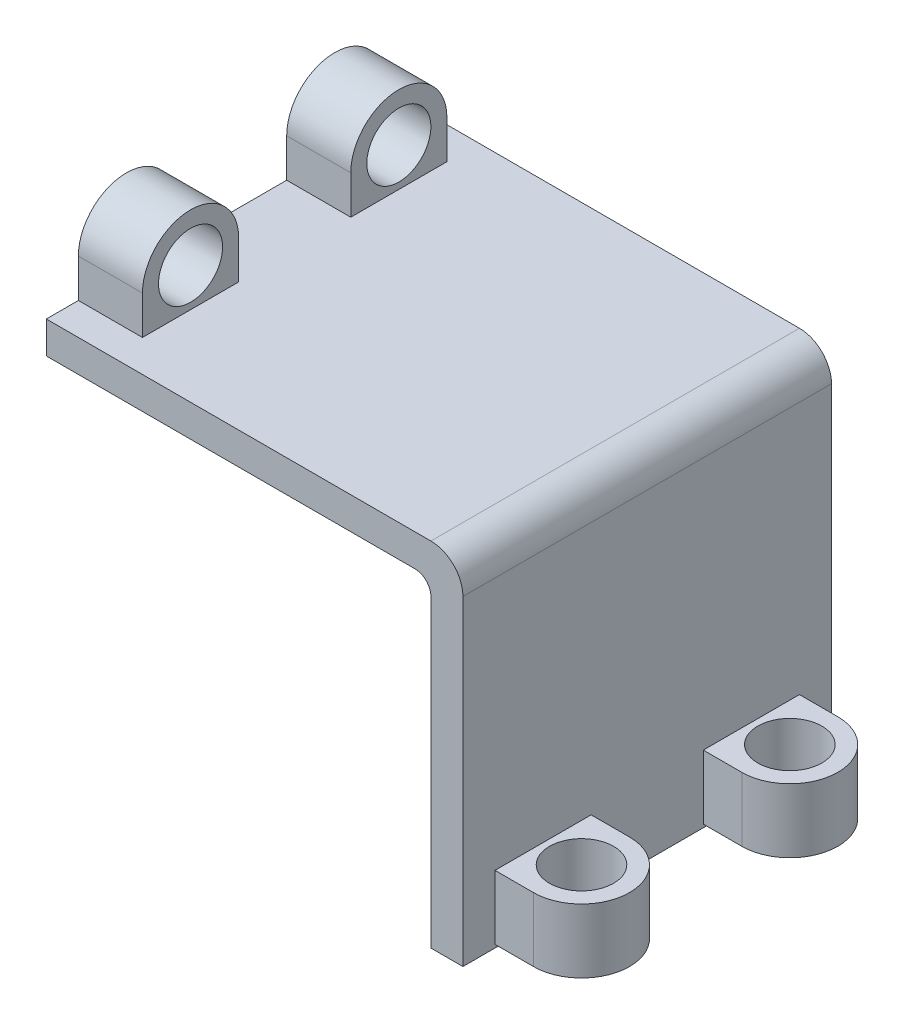
ISO-10303-21;
HEADER;
FILE_DESCRIPTION(('STEP AP214'),'2;1');
FILE_NAME('part.step','',(''),(''),'','','');
FILE_SCHEMA(('AUTOMOTIVE_DESIGN { 1 0 10303 214 1 1 1 1 }'));
ENDSEC;
DATA;
#1=APPLICATION_CONTEXT('core data for automotive mechanical design processes');
#2=APPLICATION_PROTOCOL_DEFINITION('international standard','automotive_design',2000,#1);
#3=PRODUCT_CONTEXT('',#1,'mechanical');
#4=PRODUCT('Part','Part','',(#3));
#5=PRODUCT_RELATED_PRODUCT_CATEGORY('part','',(#4));
#6=PRODUCT_DEFINITION_FORMATION('','',#4);
#7=PRODUCT_DEFINITION_CONTEXT('part definition',#1,'design');
#8=PRODUCT_DEFINITION('design','',#6,#7);
#9=PRODUCT_DEFINITION_SHAPE('','',#8);
#10=(LENGTH_UNIT() NAMED_UNIT(*) SI_UNIT(.MILLI.,.METRE.));
#11=(NAMED_UNIT(*) PLANE_ANGLE_UNIT() SI_UNIT($,.RADIAN.));
#12=(NAMED_UNIT(*) SI_UNIT($,.STERADIAN.) SOLID_ANGLE_UNIT());
#13=UNCERTAINTY_MEASURE_WITH_UNIT(LENGTH_MEASURE(1.E-05),#10,'distance_accuracy_value','');
#14=(GEOMETRIC_REPRESENTATION_CONTEXT(3) GLOBAL_UNCERTAINTY_ASSIGNED_CONTEXT((#13)) GLOBAL_UNIT_ASSIGNED_CONTEXT((#10,
#11,#12)) REPRESENTATION_CONTEXT('',''));
#15=CARTESIAN_POINT('',(0.,0.,0.));
#16=DIRECTION('',(0.,0.,1.));
#17=DIRECTION('',(1.,0.,0.));
#18=AXIS2_PLACEMENT_3D('',#15,#16,#17);
#19=CARTESIAN_POINT('',(1.,0.,11.5));
#20=DIRECTION('',(-1.,0.,0.));
#21=DIRECTION('',(0.,0.,1.));
#22=AXIS2_PLACEMENT_3D('',#19,#20,#21);
#23=PLANE('',#22);
#24=DIRECTION('',(0.,0.,1.));
#25=VECTOR('',#24,1.);
#26=CARTESIAN_POINT('',(1.,2.1,0.));
#27=LINE('',#26,#25);
#28=CARTESIAN_POINT('',(1.,2.1,7.5));
#29=VERTEX_POINT('',#28);
#30=CARTESIAN_POINT('',(1.,2.1,10.5));
#31=VERTEX_POINT('',#30);
#32=EDGE_CURVE('E297',#29,#31,#27,.T.);
#33=ORIENTED_EDGE('',*,*,#32,.F.);
#34=DIRECTION('',(0.,-1.,0.));
#35=VECTOR('',#34,1.);
#36=CARTESIAN_POINT('',(1.,2.1,7.5));
#37=LINE('',#36,#35);
#38=CARTESIAN_POINT('',(1.,0.1,7.5));
#39=VERTEX_POINT('',#38);
#40=EDGE_CURVE('E321',#29,#39,#37,.T.);
#41=ORIENTED_EDGE('',*,*,#40,.T.);
#42=DIRECTION('',(0.,0.,1.));
#43=VECTOR('',#42,1.);
#44=CARTESIAN_POINT('',(1.,0.1,0.));
#45=LINE('',#44,#43);
#46=CARTESIAN_POINT('',(1.,0.1,10.5));
#47=VERTEX_POINT('',#46);
#48=EDGE_CURVE('E314',#39,#47,#45,.T.);
#49=ORIENTED_EDGE('',*,*,#48,.T.);
#50=DIRECTION('',(0.,-1.,0.));
#51=VECTOR('',#50,1.);
#52=CARTESIAN_POINT('',(1.,2.1,10.5));
#53=LINE('',#52,#51);
#54=EDGE_CURVE('E326',#31,#47,#53,.T.);
#55=ORIENTED_EDGE('',*,*,#54,.F.);
#56=EDGE_LOOP('',(#33,#41,#49,#55));
#57=FACE_BOUND('',#56,.T.);
#58=DIRECTION('',(0.,1.,0.));
#59=VECTOR('',#58,1.);
#60=CARTESIAN_POINT('',(1.,0.,0.));
#61=LINE('',#60,#59);
#62=CARTESIAN_POINT('',(1.,0.,0.));
#63=VERTEX_POINT('',#62);
#64=CARTESIAN_POINT('',(1.,9.99999999999999,0.));
#65=VERTEX_POINT('',#64);
#66=EDGE_CURVE('E417',#63,#65,#61,.T.);
#67=ORIENTED_EDGE('',*,*,#66,.T.);
#68=DIRECTION('',(0.,0.,-1.));
#69=VECTOR('',#68,1.);
#70=CARTESIAN_POINT('',(1.,9.99999999999999,11.5));
#71=LINE('',#70,#69);
#72=CARTESIAN_POINT('',(1.,9.99999999999999,11.5));
#73=VERTEX_POINT('',#72);
#74=EDGE_CURVE('E456',#73,#65,#71,.T.);
#75=ORIENTED_EDGE('',*,*,#74,.F.);
#76=DIRECTION('',(0.,1.,0.));
#77=VECTOR('',#76,1.);
#78=CARTESIAN_POINT('',(1.,0.,11.5));
#79=LINE('',#78,#77);
#80=CARTESIAN_POINT('',(1.,0.,11.5));
#81=VERTEX_POINT('',#80);
#82=EDGE_CURVE('E392',#81,#73,#79,.T.);
#83=ORIENTED_EDGE('',*,*,#82,.F.);
#84=DIRECTION('',(0.,0.,-1.));
#85=VECTOR('',#84,1.);
#86=CARTESIAN_POINT('',(1.,0.,11.5));
#87=LINE('',#86,#85);
#88=EDGE_CURVE('E50',#81,#63,#87,.T.);
#89=ORIENTED_EDGE('',*,*,#88,.T.);
#90=EDGE_LOOP('',(#67,#75,#83,#89));
#91=FACE_BOUND('',#90,.T.);
#92=DIRECTION('',(0.,0.,-1.));
#93=VECTOR('',#92,1.);
#94=CARTESIAN_POINT('',(1.,2.1,11.5));
#95=LINE('',#94,#93);
#96=CARTESIAN_POINT('',(1.,2.1,4.));
#97=VERTEX_POINT('',#96);
#98=CARTESIAN_POINT('',(1.,2.1,1.));
#99=VERTEX_POINT('',#98);
#100=EDGE_CURVE('E207',#97,#99,#95,.T.);
#101=ORIENTED_EDGE('',*,*,#100,.T.);
#102=DIRECTION('',(0.,-1.,0.));
#103=VECTOR('',#102,1.);
#104=CARTESIAN_POINT('',(1.,2.1,1.));
#105=LINE('',#104,#103);
#106=CARTESIAN_POINT('',(1.,0.1,1.));
#107=VERTEX_POINT('',#106);
#108=EDGE_CURVE('E231',#99,#107,#105,.T.);
#109=ORIENTED_EDGE('',*,*,#108,.T.);
#110=DIRECTION('',(0.,0.,-1.));
#111=VECTOR('',#110,1.);
#112=CARTESIAN_POINT('',(1.,0.1,11.5));
#113=LINE('',#112,#111);
#114=CARTESIAN_POINT('',(1.,0.1,4.));
#115=VERTEX_POINT('',#114);
#116=EDGE_CURVE('E229',#115,#107,#113,.T.);
#117=ORIENTED_EDGE('',*,*,#116,.F.);
#118=DIRECTION('',(0.,-1.,0.));
#119=VECTOR('',#118,1.);
#120=CARTESIAN_POINT('',(1.,2.1,4.));
#121=LINE('',#120,#119);
#122=EDGE_CURVE('E223',#97,#115,#121,.T.);
#123=ORIENTED_EDGE('',*,*,#122,.F.);
#124=EDGE_LOOP('',(#101,#109,#117,#123));
#125=FACE_BOUND('',#124,.T.);
#126=ADVANCED_FACE('F41',(#57,#91,#125),#23,.F.);
#127=CARTESIAN_POINT('',(0.,11.,11.5));
#128=DIRECTION('',(0.,-1.,0.));
#129=DIRECTION('',(1.,0.,0.));
#130=AXIS2_PLACEMENT_3D('',#127,#128,#129);
#131=PLANE('',#130);
#132=DIRECTION('',(-1.,0.,0.));
#133=VECTOR('',#132,1.);
#134=CARTESIAN_POINT('',(-10.,11.,4.));
#135=LINE('',#134,#133);
#136=CARTESIAN_POINT('',(-10.,11.,4.));
#137=VERTEX_POINT('',#136);
#138=CARTESIAN_POINT('',(-12.,11.,4.));
#139=VERTEX_POINT('',#138);
#140=EDGE_CURVE('E278',#137,#139,#135,.T.);
#141=ORIENTED_EDGE('',*,*,#140,.T.);
#142=DIRECTION('',(0.,0.,-1.));
#143=VECTOR('',#142,1.);
#144=CARTESIAN_POINT('',(-12.,11.,11.5));
#145=LINE('',#144,#143);
#146=CARTESIAN_POINT('',(-12.,11.,7.5));
#147=VERTEX_POINT('',#146);
#148=EDGE_CURVE('E452',#147,#139,#145,.T.);
#149=ORIENTED_EDGE('',*,*,#148,.F.);
#150=DIRECTION('',(-1.,0.,0.));
#151=VECTOR('',#150,1.);
#152=CARTESIAN_POINT('',(-10.,11.,7.5));
#153=LINE('',#152,#151);
#154=CARTESIAN_POINT('',(-10.,11.,7.5));
#155=VERTEX_POINT('',#154);
#156=EDGE_CURVE('E378',#155,#147,#153,.T.);
#157=ORIENTED_EDGE('',*,*,#156,.F.);
#158=DIRECTION('',(0.,0.,-1.));
#159=VECTOR('',#158,1.);
#160=CARTESIAN_POINT('',(-10.,11.,0.));
#161=LINE('',#160,#159);
#162=CARTESIAN_POINT('',(-10.,11.,10.5));
#163=VERTEX_POINT('',#162);
#164=EDGE_CURVE('E345',#163,#155,#161,.T.);
#165=ORIENTED_EDGE('',*,*,#164,.F.);
#166=DIRECTION('',(-1.,0.,0.));
#167=VECTOR('',#166,1.);
#168=CARTESIAN_POINT('',(-10.,11.,10.5));
#169=LINE('',#168,#167);
#170=CARTESIAN_POINT('',(-12.,11.,10.5));
#171=VERTEX_POINT('',#170);
#172=EDGE_CURVE('E374',#163,#171,#169,.T.);
#173=ORIENTED_EDGE('',*,*,#172,.T.);
#174=CARTESIAN_POINT('',(-12.,11.,11.5));
#175=VERTEX_POINT('',#174);
#176=EDGE_CURVE('E447',#175,#171,#145,.T.);
#177=ORIENTED_EDGE('',*,*,#176,.F.);
#178=DIRECTION('',(-1.,0.,0.));
#179=VECTOR('',#178,1.);
#180=CARTESIAN_POINT('',(0.,11.,11.5));
#181=LINE('',#180,#179);
#182=CARTESIAN_POINT('',(0.,11.,11.5));
#183=VERTEX_POINT('',#182);
#184=EDGE_CURVE('E398',#183,#175,#181,.T.);
#185=ORIENTED_EDGE('',*,*,#184,.F.);
#186=DIRECTION('',(0.,0.,-1.));
#187=VECTOR('',#186,1.);
#188=CARTESIAN_POINT('',(0.,11.,11.5));
#189=LINE('',#188,#187);
#190=CARTESIAN_POINT('',(0.,11.,0.));
#191=VERTEX_POINT('',#190);
#192=EDGE_CURVE('E451',#183,#191,#189,.T.);
#193=ORIENTED_EDGE('',*,*,#192,.T.);
#194=DIRECTION('',(-1.,0.,0.));
#195=VECTOR('',#194,1.);
#196=CARTESIAN_POINT('',(0.,11.,0.));
#197=LINE('',#196,#195);
#198=CARTESIAN_POINT('',(-12.,11.,0.));
#199=VERTEX_POINT('',#198);
#200=EDGE_CURVE('E423',#191,#199,#197,.T.);
#201=ORIENTED_EDGE('',*,*,#200,.T.);
#202=CARTESIAN_POINT('',(-12.,11.,1.));
#203=VERTEX_POINT('',#202);
#204=EDGE_CURVE('E446',#203,#199,#145,.T.);
#205=ORIENTED_EDGE('',*,*,#204,.F.);
#206=DIRECTION('',(-1.,0.,0.));
#207=VECTOR('',#206,1.);
#208=CARTESIAN_POINT('',(-10.,11.,1.));
#209=LINE('',#208,#207);
#210=CARTESIAN_POINT('',(-10.,11.,1.));
#211=VERTEX_POINT('',#210);
#212=EDGE_CURVE('E282',#211,#203,#209,.T.);
#213=ORIENTED_EDGE('',*,*,#212,.F.);
#214=DIRECTION('',(0.,0.,1.));
#215=VECTOR('',#214,1.);
#216=CARTESIAN_POINT('',(-10.,11.,11.5));
#217=LINE('',#216,#215);
#218=EDGE_CURVE('E251',#211,#137,#217,.T.);
#219=ORIENTED_EDGE('',*,*,#218,.T.);
#220=EDGE_LOOP('',(#141,#149,#157,#165,#173,#177,#185,#193,#201,#205,#213,#219));
#221=FACE_BOUND('',#220,.T.);
#222=ADVANCED_FACE('F479',(#221),#131,.F.);
#223=CARTESIAN_POINT('',(0.,9.5,11.5));
#224=DIRECTION('',(1.,0.,0.));
#225=DIRECTION('',(0.,1.,0.));
#226=AXIS2_PLACEMENT_3D('',#223,#224,#225);
#227=PLANE('',#226);
#228=DIRECTION('',(0.,-1.,0.));
#229=VECTOR('',#228,1.);
#230=CARTESIAN_POINT('',(0.,9.5,0.));
#231=LINE('',#230,#229);
#232=CARTESIAN_POINT('',(0.,9.5,0.));
#233=VERTEX_POINT('',#232);
#234=CARTESIAN_POINT('',(0.,0.,0.));
#235=VERTEX_POINT('',#234);
#236=EDGE_CURVE('E373',#233,#235,#231,.T.);
#237=ORIENTED_EDGE('',*,*,#236,.T.);
#238=DIRECTION('',(0.,0.,-1.));
#239=VECTOR('',#238,1.);
#240=CARTESIAN_POINT('',(0.,0.,11.5));
#241=LINE('',#240,#239);
#242=CARTESIAN_POINT('',(0.,0.,11.5));
#243=VERTEX_POINT('',#242);
#244=EDGE_CURVE('E11',#243,#235,#241,.T.);
#245=ORIENTED_EDGE('',*,*,#244,.F.);
#246=DIRECTION('',(0.,-1.,0.));
#247=VECTOR('',#246,1.);
#248=CARTESIAN_POINT('',(0.,9.5,11.5));
#249=LINE('',#248,#247);
#250=CARTESIAN_POINT('',(0.,9.5,11.5));
#251=VERTEX_POINT('',#250);
#252=EDGE_CURVE('E384',#251,#243,#249,.T.);
#253=ORIENTED_EDGE('',*,*,#252,.F.);
#254=DIRECTION('',(0.,0.,-1.));
#255=VECTOR('',#254,1.);
#256=CARTESIAN_POINT('',(0.,9.5,11.5));
#257=LINE('',#256,#255);
#258=EDGE_CURVE('E410',#251,#233,#257,.T.);
#259=ORIENTED_EDGE('',*,*,#258,.T.);
#260=EDGE_LOOP('',(#237,#245,#253,#259));
#261=FACE_BOUND('',#260,.T.);
#262=ADVANCED_FACE('F43',(#261),#227,.F.);
#263=CARTESIAN_POINT('',(0.,0.,11.5));
#264=DIRECTION('',(0.,1.,0.));
#265=DIRECTION('',(0.,0.,1.));
#266=AXIS2_PLACEMENT_3D('',#263,#264,#265);
#267=PLANE('',#266);
#268=DIRECTION('',(1.,0.,0.));
#269=VECTOR('',#268,1.);
#270=CARTESIAN_POINT('',(0.,0.,0.));
#271=LINE('',#270,#269);
#272=EDGE_CURVE('E414',#235,#63,#271,.T.);
#273=ORIENTED_EDGE('',*,*,#272,.T.);
#274=ORIENTED_EDGE('',*,*,#88,.F.);
#275=DIRECTION('',(1.,0.,0.));
#276=VECTOR('',#275,1.);
#277=CARTESIAN_POINT('',(0.,0.,11.5));
#278=LINE('',#277,#276);
#279=EDGE_CURVE('E388',#243,#81,#278,.T.);
#280=ORIENTED_EDGE('',*,*,#279,.F.);
#281=ORIENTED_EDGE('',*,*,#244,.T.);
#282=EDGE_LOOP('',(#273,#274,#280,#281));
#283=FACE_BOUND('',#282,.T.);
#284=ADVANCED_FACE('F488',(#283),#267,.F.);
#285=CARTESIAN_POINT('',(0.,10.,11.5));
#286=DIRECTION('',(0.,0.,-1.));
#287=DIRECTION('',(-1.,0.,0.));
#288=AXIS2_PLACEMENT_3D('',#285,#286,#287);
#289=CYLINDRICAL_SURFACE('',#288,1.);
#290=CARTESIAN_POINT('',(0.,10.,0.));
#291=DIRECTION('',(0.,0.,1.));
#292=DIRECTION('',(1.,0.,0.));
#293=AXIS2_PLACEMENT_3D('',#290,#291,#292);
#294=CIRCLE('',#293,1.);
#295=EDGE_CURVE('E420',#65,#191,#294,.T.);
#296=ORIENTED_EDGE('',*,*,#295,.T.);
#297=ORIENTED_EDGE('',*,*,#192,.F.);
#298=CARTESIAN_POINT('',(0.,10.,11.5));
#299=DIRECTION('',(0.,0.,1.));
#300=DIRECTION('',(1.,0.,0.));
#301=AXIS2_PLACEMENT_3D('',#298,#299,#300);
#302=CIRCLE('',#301,1.);
#303=EDGE_CURVE('E395',#73,#183,#302,.T.);
#304=ORIENTED_EDGE('',*,*,#303,.F.);
#305=ORIENTED_EDGE('',*,*,#74,.T.);
#306=EDGE_LOOP('',(#296,#297,#304,#305));
#307=FACE_BOUND('',#306,.T.);
#308=ADVANCED_FACE('F475',(#307),#289,.T.);
#309=CARTESIAN_POINT('',(-12.,11.,11.5));
#310=DIRECTION('',(1.,0.,0.));
#311=DIRECTION('',(0.,1.,0.));
#312=AXIS2_PLACEMENT_3D('',#309,#310,#311);
#313=PLANE('',#312);
#314=DIRECTION('',(0.,-1.,0.));
#315=VECTOR('',#314,1.);
#316=CARTESIAN_POINT('',(-12.,11.,0.));
#317=LINE('',#316,#315);
#318=CARTESIAN_POINT('',(-12.,10.,0.));
#319=VERTEX_POINT('',#318);
#320=EDGE_CURVE('E427',#199,#319,#317,.T.);
#321=ORIENTED_EDGE('',*,*,#320,.T.);
#322=DIRECTION('',(0.,0.,-1.));
#323=VECTOR('',#322,1.);
#324=CARTESIAN_POINT('',(-12.,10.,11.5));
#325=LINE('',#324,#323);
#326=CARTESIAN_POINT('',(-12.,10.,11.5));
#327=VERTEX_POINT('',#326);
#328=EDGE_CURVE('E442',#327,#319,#325,.T.);
#329=ORIENTED_EDGE('',*,*,#328,.F.);
#330=DIRECTION('',(0.,-1.,0.));
#331=VECTOR('',#330,1.);
#332=CARTESIAN_POINT('',(-12.,11.,11.5));
#333=LINE('',#332,#331);
#334=EDGE_CURVE('E401',#175,#327,#333,.T.);
#335=ORIENTED_EDGE('',*,*,#334,.F.);
#336=ORIENTED_EDGE('',*,*,#176,.T.);
#337=DIRECTION('',(0.,1.,0.));
#338=VECTOR('',#337,1.);
#339=CARTESIAN_POINT('',(-12.,0.,10.5));
#340=LINE('',#339,#338);
#341=CARTESIAN_POINT('',(-12.,12.2,10.5));
#342=VERTEX_POINT('',#341);
#343=EDGE_CURVE('E363',#171,#342,#340,.T.);
#344=ORIENTED_EDGE('',*,*,#343,.T.);
#345=CARTESIAN_POINT('',(-12.,12.2,9.));
#346=DIRECTION('',(-1.,0.,0.));
#347=DIRECTION('',(0.,-1.,0.));
#348=AXIS2_PLACEMENT_3D('',#345,#346,#347);
#349=CIRCLE('',#348,1.5);
#350=CARTESIAN_POINT('',(-12.,12.2,7.5));
#351=VERTEX_POINT('',#350);
#352=EDGE_CURVE('E325',#351,#342,#349,.F.);
#353=ORIENTED_EDGE('',*,*,#352,.F.);
#354=DIRECTION('',(0.,-1.,0.));
#355=VECTOR('',#354,1.);
#356=CARTESIAN_POINT('',(-12.,0.,7.5));
#357=LINE('',#356,#355);
#358=EDGE_CURVE('E360',#351,#147,#357,.T.);
#359=ORIENTED_EDGE('',*,*,#358,.T.);
#360=ORIENTED_EDGE('',*,*,#148,.T.);
#361=DIRECTION('',(0.,-1.,0.));
#362=VECTOR('',#361,1.);
#363=CARTESIAN_POINT('',(-12.,0.,4.));
#364=LINE('',#363,#362);
#365=CARTESIAN_POINT('',(-12.,12.2,4.));
#366=VERTEX_POINT('',#365);
#367=EDGE_CURVE('E268',#366,#139,#364,.T.);
#368=ORIENTED_EDGE('',*,*,#367,.F.);
#369=CARTESIAN_POINT('',(-12.,12.2,2.5));
#370=DIRECTION('',(1.,0.,0.));
#371=DIRECTION('',(0.,-1.,0.));
#372=AXIS2_PLACEMENT_3D('',#369,#370,#371);
#373=CIRCLE('',#372,1.5);
#374=CARTESIAN_POINT('',(-12.,12.2,1.));
#375=VERTEX_POINT('',#374);
#376=EDGE_CURVE('E263',#366,#375,#373,.F.);
#377=ORIENTED_EDGE('',*,*,#376,.T.);
#378=DIRECTION('',(0.,1.,0.));
#379=VECTOR('',#378,1.);
#380=CARTESIAN_POINT('',(-12.,0.,1.));
#381=LINE('',#380,#379);
#382=EDGE_CURVE('E65',#203,#375,#381,.T.);
#383=ORIENTED_EDGE('',*,*,#382,.F.);
#384=ORIENTED_EDGE('',*,*,#204,.T.);
#385=EDGE_LOOP('',(#321,#329,#335,#336,#344,#353,#359,#360,#368,#377,#383,#384));
#386=FACE_BOUND('',#385,.T.);
#387=CARTESIAN_POINT('',(-12.,12.2,9.));
#388=DIRECTION('',(-1.,0.,0.));
#389=DIRECTION('',(0.,-1.,0.));
#390=AXIS2_PLACEMENT_3D('',#387,#388,#389);
#391=CIRCLE('',#390,0.999999999999999);
#392=CARTESIAN_POINT('',(-12.,11.2,9.));
#393=VERTEX_POINT('',#392);
#394=EDGE_CURVE('E341',#393,#393,#391,.T.);
#395=ORIENTED_EDGE('',*,*,#394,.F.);
#396=EDGE_LOOP('',(#395));
#397=FACE_BOUND('',#396,.T.);
#398=CARTESIAN_POINT('',(-12.,12.2,2.5));
#399=DIRECTION('',(1.,0.,0.));
#400=DIRECTION('',(0.,-1.,0.));
#401=AXIS2_PLACEMENT_3D('',#398,#399,#400);
#402=CIRCLE('',#401,0.999999999999999);
#403=CARTESIAN_POINT('',(-12.,11.2,2.5));
#404=VERTEX_POINT('',#403);
#405=EDGE_CURVE('E248',#404,#404,#402,.T.);
#406=ORIENTED_EDGE('',*,*,#405,.T.);
#407=EDGE_LOOP('',(#406));
#408=FACE_BOUND('',#407,.T.);
#409=ADVANCED_FACE('F500',(#386,#397,#408),#313,.F.);
#410=CARTESIAN_POINT('',(-12.,10.,11.5));
#411=DIRECTION('',(0.,1.,0.));
#412=DIRECTION('',(0.,0.,1.));
#413=AXIS2_PLACEMENT_3D('',#410,#411,#412);
#414=PLANE('',#413);
#415=DIRECTION('',(1.,0.,0.));
#416=VECTOR('',#415,1.);
#417=CARTESIAN_POINT('',(-12.,10.,0.));
#418=LINE('',#417,#416);
#419=CARTESIAN_POINT('',(-0.500000000000004,10.,0.));
#420=VERTEX_POINT('',#419);
#421=EDGE_CURVE('E430',#319,#420,#418,.T.);
#422=ORIENTED_EDGE('',*,*,#421,.T.);
#423=DIRECTION('',(0.,0.,-1.));
#424=VECTOR('',#423,1.);
#425=CARTESIAN_POINT('',(-0.500000000000004,10.,11.5));
#426=LINE('',#425,#424);
#427=CARTESIAN_POINT('',(-0.500000000000004,10.,11.5));
#428=VERTEX_POINT('',#427);
#429=EDGE_CURVE('E438',#428,#420,#426,.T.);
#430=ORIENTED_EDGE('',*,*,#429,.F.);
#431=DIRECTION('',(1.,0.,0.));
#432=VECTOR('',#431,1.);
#433=CARTESIAN_POINT('',(-12.,10.,11.5));
#434=LINE('',#433,#432);
#435=EDGE_CURVE('E404',#327,#428,#434,.T.);
#436=ORIENTED_EDGE('',*,*,#435,.F.);
#437=ORIENTED_EDGE('',*,*,#328,.T.);
#438=EDGE_LOOP('',(#422,#430,#436,#437));
#439=FACE_BOUND('',#438,.T.);
#440=ADVANCED_FACE('F499',(#439),#414,.F.);
#441=CARTESIAN_POINT('',(-0.500000000000001,9.5,11.5));
#442=DIRECTION('',(0.,0.,-1.));
#443=DIRECTION('',(-1.,0.,0.));
#444=AXIS2_PLACEMENT_3D('',#441,#442,#443);
#445=CYLINDRICAL_SURFACE('',#444,0.5);
#446=CARTESIAN_POINT('',(-0.500000000000001,9.5,0.));
#447=DIRECTION('',(0.,0.,-1.));
#448=DIRECTION('',(1.,0.,0.));
#449=AXIS2_PLACEMENT_3D('',#446,#447,#448);
#450=CIRCLE('',#449,0.5);
#451=EDGE_CURVE('E389',#420,#233,#450,.T.);
#452=ORIENTED_EDGE('',*,*,#451,.T.);
#453=ORIENTED_EDGE('',*,*,#258,.F.);
#454=CARTESIAN_POINT('',(-0.500000000000001,9.5,11.5));
#455=DIRECTION('',(0.,0.,-1.));
#456=DIRECTION('',(1.,0.,0.));
#457=AXIS2_PLACEMENT_3D('',#454,#455,#456);
#458=CIRCLE('',#457,0.5);
#459=EDGE_CURVE('E407',#428,#251,#458,.T.);
#460=ORIENTED_EDGE('',*,*,#459,.F.);
#461=ORIENTED_EDGE('',*,*,#429,.T.);
#462=EDGE_LOOP('',(#452,#453,#460,#461));
#463=FACE_BOUND('',#462,.T.);
#464=ADVANCED_FACE('F494',(#463),#445,.F.);
#465=CARTESIAN_POINT('',(0.,10.,11.5));
#466=DIRECTION('',(0.,0.,1.));
#467=DIRECTION('',(1.,0.,0.));
#468=AXIS2_PLACEMENT_3D('',#465,#466,#467);
#469=PLANE('',#468);
#470=ORIENTED_EDGE('',*,*,#252,.T.);
#471=ORIENTED_EDGE('',*,*,#279,.T.);
#472=ORIENTED_EDGE('',*,*,#82,.T.);
#473=ORIENTED_EDGE('',*,*,#303,.T.);
#474=ORIENTED_EDGE('',*,*,#184,.T.);
#475=ORIENTED_EDGE('',*,*,#334,.T.);
#476=ORIENTED_EDGE('',*,*,#435,.T.);
#477=ORIENTED_EDGE('',*,*,#459,.T.);
#478=EDGE_LOOP('',(#470,#471,#472,#473,#474,#475,#476,#477));
#479=FACE_BOUND('',#478,.T.);
#480=ADVANCED_FACE('F484',(#479),#469,.T.);
#481=CARTESIAN_POINT('',(0.,10.,0.));
#482=DIRECTION('',(0.,0.,1.));
#483=DIRECTION('',(1.,0.,0.));
#484=AXIS2_PLACEMENT_3D('',#481,#482,#483);
#485=PLANE('',#484);
#486=ORIENTED_EDGE('',*,*,#236,.F.);
#487=ORIENTED_EDGE('',*,*,#451,.F.);
#488=ORIENTED_EDGE('',*,*,#421,.F.);
#489=ORIENTED_EDGE('',*,*,#320,.F.);
#490=ORIENTED_EDGE('',*,*,#200,.F.);
#491=ORIENTED_EDGE('',*,*,#295,.F.);
#492=ORIENTED_EDGE('',*,*,#66,.F.);
#493=ORIENTED_EDGE('',*,*,#272,.F.);
#494=EDGE_LOOP('',(#486,#487,#488,#489,#490,#491,#492,#493));
#495=FACE_BOUND('',#494,.T.);
#496=ADVANCED_FACE('F470',(#495),#485,.F.);
#497=CARTESIAN_POINT('',(-10.,12.2,9.));
#498=DIRECTION('',(-1.,0.,0.));
#499=DIRECTION('',(0.,-1.,0.));
#500=AXIS2_PLACEMENT_3D('',#497,#498,#499);
#501=CYLINDRICAL_SURFACE('',#500,1.5);
#502=ORIENTED_EDGE('',*,*,#352,.T.);
#503=DIRECTION('',(-1.,0.,0.));
#504=VECTOR('',#503,1.);
#505=CARTESIAN_POINT('',(-10.,12.2,10.5));
#506=LINE('',#505,#504);
#507=CARTESIAN_POINT('',(-10.,12.2,10.5));
#508=VERTEX_POINT('',#507);
#509=EDGE_CURVE('E370',#508,#342,#506,.T.);
#510=ORIENTED_EDGE('',*,*,#509,.F.);
#511=CARTESIAN_POINT('',(-10.,12.2,9.));
#512=DIRECTION('',(-1.,0.,0.));
#513=DIRECTION('',(0.,-1.,0.));
#514=AXIS2_PLACEMENT_3D('',#511,#512,#513);
#515=CIRCLE('',#514,1.5);
#516=CARTESIAN_POINT('',(-10.,12.2,7.5));
#517=VERTEX_POINT('',#516);
#518=EDGE_CURVE('E337',#517,#508,#515,.F.);
#519=ORIENTED_EDGE('',*,*,#518,.F.);
#520=DIRECTION('',(-1.,0.,0.));
#521=VECTOR('',#520,1.);
#522=CARTESIAN_POINT('',(-10.,12.2,7.5));
#523=LINE('',#522,#521);
#524=EDGE_CURVE('E356',#517,#351,#523,.T.);
#525=ORIENTED_EDGE('',*,*,#524,.T.);
#526=EDGE_LOOP('',(#502,#510,#519,#525));
#527=FACE_BOUND('',#526,.T.);
#528=ADVANCED_FACE('F710',(#527),#501,.T.);
#529=CARTESIAN_POINT('',(-9.99999999999997,0.,10.5));
#530=DIRECTION('',(0.,0.,1.));
#531=DIRECTION('',(1.,0.,0.));
#532=AXIS2_PLACEMENT_3D('',#529,#530,#531);
#533=PLANE('',#532);
#534=ORIENTED_EDGE('',*,*,#343,.F.);
#535=ORIENTED_EDGE('',*,*,#172,.F.);
#536=DIRECTION('',(0.,1.,0.));
#537=VECTOR('',#536,1.);
#538=CARTESIAN_POINT('',(-9.99999999999997,0.,10.5));
#539=LINE('',#538,#537);
#540=EDGE_CURVE('E348',#163,#508,#539,.T.);
#541=ORIENTED_EDGE('',*,*,#540,.T.);
#542=ORIENTED_EDGE('',*,*,#509,.T.);
#543=EDGE_LOOP('',(#534,#535,#541,#542));
#544=FACE_BOUND('',#543,.T.);
#545=ADVANCED_FACE('F707',(#544),#533,.T.);
#546=CARTESIAN_POINT('',(-9.99999999999997,0.,7.5));
#547=DIRECTION('',(0.,0.,-1.));
#548=DIRECTION('',(-1.,0.,0.));
#549=AXIS2_PLACEMENT_3D('',#546,#547,#548);
#550=PLANE('',#549);
#551=ORIENTED_EDGE('',*,*,#358,.F.);
#552=ORIENTED_EDGE('',*,*,#524,.F.);
#553=DIRECTION('',(0.,-1.,0.));
#554=VECTOR('',#553,1.);
#555=CARTESIAN_POINT('',(-9.99999999999997,0.,7.5));
#556=LINE('',#555,#554);
#557=EDGE_CURVE('E340',#517,#155,#556,.T.);
#558=ORIENTED_EDGE('',*,*,#557,.T.);
#559=ORIENTED_EDGE('',*,*,#156,.T.);
#560=EDGE_LOOP('',(#551,#552,#558,#559));
#561=FACE_BOUND('',#560,.T.);
#562=ADVANCED_FACE('F705',(#561),#550,.T.);
#563=CARTESIAN_POINT('',(-10.,12.2,9.));
#564=DIRECTION('',(-1.,0.,0.));
#565=DIRECTION('',(0.,-1.,0.));
#566=AXIS2_PLACEMENT_3D('',#563,#564,#565);
#567=CYLINDRICAL_SURFACE('',#566,0.999999999999999);
#568=CARTESIAN_POINT('',(-10.,12.2,9.));
#569=DIRECTION('',(-1.,0.,0.));
#570=DIRECTION('',(0.,-1.,0.));
#571=AXIS2_PLACEMENT_3D('',#568,#569,#570);
#572=CIRCLE('',#571,0.999999999999999);
#573=CARTESIAN_POINT('',(-10.,11.2,9.));
#574=VERTEX_POINT('',#573);
#575=EDGE_CURVE('E352',#574,#574,#572,.T.);
#576=ORIENTED_EDGE('',*,*,#575,.F.);
#577=EDGE_LOOP('',(#576));
#578=FACE_BOUND('',#577,.T.);
#579=ORIENTED_EDGE('',*,*,#394,.T.);
#580=EDGE_LOOP('',(#579));
#581=FACE_BOUND('',#580,.T.);
#582=ADVANCED_FACE('F701',(#578,#581),#567,.F.);
#583=CARTESIAN_POINT('',(-9.99999999999997,0.,0.));
#584=DIRECTION('',(-1.,0.,0.));
#585=DIRECTION('',(0.,-1.,0.));
#586=AXIS2_PLACEMENT_3D('',#583,#584,#585);
#587=PLANE('',#586);
#588=ORIENTED_EDGE('',*,*,#518,.T.);
#589=ORIENTED_EDGE('',*,*,#540,.F.);
#590=ORIENTED_EDGE('',*,*,#164,.T.);
#591=ORIENTED_EDGE('',*,*,#557,.F.);
#592=EDGE_LOOP('',(#588,#589,#590,#591));
#593=FACE_BOUND('',#592,.T.);
#594=ORIENTED_EDGE('',*,*,#575,.T.);
#595=EDGE_LOOP('',(#594));
#596=FACE_BOUND('',#595,.T.);
#597=ADVANCED_FACE('F697',(#593,#596),#587,.F.);
#598=CARTESIAN_POINT('',(0.,2.1,7.5));
#599=DIRECTION('',(0.,0.,1.));
#600=DIRECTION('',(1.,0.,0.));
#601=AXIS2_PLACEMENT_3D('',#598,#599,#600);
#602=PLANE('',#601);
#603=DIRECTION('',(-1.,0.,0.));
#604=VECTOR('',#603,1.);
#605=CARTESIAN_POINT('',(0.,0.1,7.5));
#606=LINE('',#605,#604);
#607=CARTESIAN_POINT('',(2.2,0.1,7.5));
#608=VERTEX_POINT('',#607);
#609=EDGE_CURVE('E277',#608,#39,#606,.T.);
#610=ORIENTED_EDGE('',*,*,#609,.T.);
#611=ORIENTED_EDGE('',*,*,#40,.F.);
#612=DIRECTION('',(-1.,0.,0.));
#613=VECTOR('',#612,1.);
#614=CARTESIAN_POINT('',(0.,2.1,7.5));
#615=LINE('',#614,#613);
#616=CARTESIAN_POINT('',(2.2,2.1,7.5));
#617=VERTEX_POINT('',#616);
#618=EDGE_CURVE('E287',#617,#29,#615,.T.);
#619=ORIENTED_EDGE('',*,*,#618,.F.);
#620=DIRECTION('',(0.,-1.,0.));
#621=VECTOR('',#620,1.);
#622=CARTESIAN_POINT('',(2.2,2.1,7.5));
#623=LINE('',#622,#621);
#624=EDGE_CURVE('E304',#617,#608,#623,.T.);
#625=ORIENTED_EDGE('',*,*,#624,.T.);
#626=EDGE_LOOP('',(#610,#611,#619,#625));
#627=FACE_BOUND('',#626,.T.);
#628=ADVANCED_FACE('F690',(#627),#602,.F.);
#629=CARTESIAN_POINT('',(0.,2.1,10.5));
#630=DIRECTION('',(0.,0.,-1.));
#631=DIRECTION('',(-1.,0.,0.));
#632=AXIS2_PLACEMENT_3D('',#629,#630,#631);
#633=PLANE('',#632);
#634=DIRECTION('',(1.,0.,0.));
#635=VECTOR('',#634,1.);
#636=CARTESIAN_POINT('',(0.,0.1,10.5));
#637=LINE('',#636,#635);
#638=CARTESIAN_POINT('',(2.2,0.1,10.5));
#639=VERTEX_POINT('',#638);
#640=EDGE_CURVE('E311',#47,#639,#637,.T.);
#641=ORIENTED_EDGE('',*,*,#640,.T.);
#642=DIRECTION('',(0.,-1.,0.));
#643=VECTOR('',#642,1.);
#644=CARTESIAN_POINT('',(2.2,2.1,10.5));
#645=LINE('',#644,#643);
#646=CARTESIAN_POINT('',(2.2,2.1,10.5));
#647=VERTEX_POINT('',#646);
#648=EDGE_CURVE('E330',#647,#639,#645,.T.);
#649=ORIENTED_EDGE('',*,*,#648,.F.);
#650=DIRECTION('',(1.,0.,0.));
#651=VECTOR('',#650,1.);
#652=CARTESIAN_POINT('',(0.,2.1,10.5));
#653=LINE('',#652,#651);
#654=EDGE_CURVE('E294',#31,#647,#653,.T.);
#655=ORIENTED_EDGE('',*,*,#654,.F.);
#656=ORIENTED_EDGE('',*,*,#54,.T.);
#657=EDGE_LOOP('',(#641,#649,#655,#656));
#658=FACE_BOUND('',#657,.T.);
#659=ADVANCED_FACE('F687',(#658),#633,.F.);
#660=CARTESIAN_POINT('',(2.2,2.1,9.));
#661=DIRECTION('',(0.,-1.,0.));
#662=DIRECTION('',(0.,0.,-1.));
#663=AXIS2_PLACEMENT_3D('',#660,#661,#662);
#664=CYLINDRICAL_SURFACE('',#663,1.5);
#665=CARTESIAN_POINT('',(2.2,0.1,9.));
#666=DIRECTION('',(0.,-1.,0.));
#667=DIRECTION('',(0.,0.,-1.));
#668=AXIS2_PLACEMENT_3D('',#665,#666,#667);
#669=CIRCLE('',#668,1.5);
#670=EDGE_CURVE('E308',#639,#608,#669,.F.);
#671=ORIENTED_EDGE('',*,*,#670,.T.);
#672=ORIENTED_EDGE('',*,*,#624,.F.);
#673=CARTESIAN_POINT('',(2.2,2.1,9.));
#674=DIRECTION('',(0.,-1.,0.));
#675=DIRECTION('',(0.,0.,-1.));
#676=AXIS2_PLACEMENT_3D('',#673,#674,#675);
#677=CIRCLE('',#676,1.5);
#678=EDGE_CURVE('E290',#647,#617,#677,.F.);
#679=ORIENTED_EDGE('',*,*,#678,.F.);
#680=ORIENTED_EDGE('',*,*,#648,.T.);
#681=EDGE_LOOP('',(#671,#672,#679,#680));
#682=FACE_BOUND('',#681,.T.);
#683=ADVANCED_FACE('F685',(#682),#664,.T.);
#684=CARTESIAN_POINT('',(2.2,2.1,9.));
#685=DIRECTION('',(0.,-1.,0.));
#686=DIRECTION('',(0.,0.,-1.));
#687=AXIS2_PLACEMENT_3D('',#684,#685,#686);
#688=CYLINDRICAL_SURFACE('',#687,1.);
#689=CARTESIAN_POINT('',(2.2,2.1,9.));
#690=DIRECTION('',(0.,-1.,0.));
#691=DIRECTION('',(0.,0.,-1.));
#692=AXIS2_PLACEMENT_3D('',#689,#690,#691);
#693=CIRCLE('',#692,1.);
#694=CARTESIAN_POINT('',(2.2,2.1,8.));
#695=VERTEX_POINT('',#694);
#696=EDGE_CURVE('E300',#695,#695,#693,.T.);
#697=ORIENTED_EDGE('',*,*,#696,.F.);
#698=EDGE_LOOP('',(#697));
#699=FACE_BOUND('',#698,.T.);
#700=CARTESIAN_POINT('',(2.2,0.1,9.));
#701=DIRECTION('',(0.,-1.,0.));
#702=DIRECTION('',(0.,0.,-1.));
#703=AXIS2_PLACEMENT_3D('',#700,#701,#702);
#704=CIRCLE('',#703,1.);
#705=CARTESIAN_POINT('',(2.2,0.1,8.));
#706=VERTEX_POINT('',#705);
#707=EDGE_CURVE('E291',#706,#706,#704,.T.);
#708=ORIENTED_EDGE('',*,*,#707,.T.);
#709=EDGE_LOOP('',(#708));
#710=FACE_BOUND('',#709,.T.);
#711=ADVANCED_FACE('F679',(#699,#710),#688,.F.);
#712=CARTESIAN_POINT('',(0.,2.1,0.));
#713=DIRECTION('',(0.,-1.,0.));
#714=DIRECTION('',(0.,0.,-1.));
#715=AXIS2_PLACEMENT_3D('',#712,#713,#714);
#716=PLANE('',#715);
#717=ORIENTED_EDGE('',*,*,#618,.T.);
#718=ORIENTED_EDGE('',*,*,#32,.T.);
#719=ORIENTED_EDGE('',*,*,#654,.T.);
#720=ORIENTED_EDGE('',*,*,#678,.T.);
#721=EDGE_LOOP('',(#717,#718,#719,#720));
#722=FACE_BOUND('',#721,.T.);
#723=ORIENTED_EDGE('',*,*,#696,.T.);
#724=EDGE_LOOP('',(#723));
#725=FACE_BOUND('',#724,.T.);
#726=ADVANCED_FACE('F676',(#722,#725),#716,.F.);
#727=CARTESIAN_POINT('',(0.,0.1,0.));
#728=DIRECTION('',(0.,-1.,0.));
#729=DIRECTION('',(0.,0.,-1.));
#730=AXIS2_PLACEMENT_3D('',#727,#728,#729);
#731=PLANE('',#730);
#732=ORIENTED_EDGE('',*,*,#609,.F.);
#733=ORIENTED_EDGE('',*,*,#670,.F.);
#734=ORIENTED_EDGE('',*,*,#640,.F.);
#735=ORIENTED_EDGE('',*,*,#48,.F.);
#736=EDGE_LOOP('',(#732,#733,#734,#735));
#737=FACE_BOUND('',#736,.T.);
#738=ORIENTED_EDGE('',*,*,#707,.F.);
#739=EDGE_LOOP('',(#738));
#740=FACE_BOUND('',#739,.T.);
#741=ADVANCED_FACE('F581',(#737,#740),#731,.T.);
#742=CARTESIAN_POINT('',(-10.,12.2,2.5));
#743=DIRECTION('',(-1.,0.,0.));
#744=DIRECTION('',(0.,-1.,0.));
#745=AXIS2_PLACEMENT_3D('',#742,#743,#744);
#746=CYLINDRICAL_SURFACE('',#745,1.5);
#747=ORIENTED_EDGE('',*,*,#376,.F.);
#748=DIRECTION('',(-1.,0.,0.));
#749=VECTOR('',#748,1.);
#750=CARTESIAN_POINT('',(-10.,12.2,4.));
#751=LINE('',#750,#749);
#752=CARTESIAN_POINT('',(-10.,12.2,4.));
#753=VERTEX_POINT('',#752);
#754=EDGE_CURVE('E274',#753,#366,#751,.T.);
#755=ORIENTED_EDGE('',*,*,#754,.F.);
#756=CARTESIAN_POINT('',(-10.,12.2,2.5));
#757=DIRECTION('',(1.,0.,0.));
#758=DIRECTION('',(0.,-1.,0.));
#759=AXIS2_PLACEMENT_3D('',#756,#757,#758);
#760=CIRCLE('',#759,1.5);
#761=CARTESIAN_POINT('',(-10.,12.2,1.));
#762=VERTEX_POINT('',#761);
#763=EDGE_CURVE('E243',#753,#762,#760,.F.);
#764=ORIENTED_EDGE('',*,*,#763,.T.);
#765=DIRECTION('',(-1.,0.,0.));
#766=VECTOR('',#765,1.);
#767=CARTESIAN_POINT('',(-10.,12.2,1.));
#768=LINE('',#767,#766);
#769=EDGE_CURVE('E262',#762,#375,#768,.T.);
#770=ORIENTED_EDGE('',*,*,#769,.T.);
#771=EDGE_LOOP('',(#747,#755,#764,#770));
#772=FACE_BOUND('',#771,.T.);
#773=ADVANCED_FACE('F520',(#772),#746,.T.);
#774=CARTESIAN_POINT('',(-9.99999999999997,0.,4.));
#775=DIRECTION('',(0.,0.,-1.));
#776=DIRECTION('',(-1.,0.,0.));
#777=AXIS2_PLACEMENT_3D('',#774,#775,#776);
#778=PLANE('',#777);
#779=ORIENTED_EDGE('',*,*,#367,.T.);
#780=ORIENTED_EDGE('',*,*,#140,.F.);
#781=DIRECTION('',(0.,-1.,0.));
#782=VECTOR('',#781,1.);
#783=CARTESIAN_POINT('',(-9.99999999999997,0.,4.));
#784=LINE('',#783,#782);
#785=EDGE_CURVE('E255',#753,#137,#784,.T.);
#786=ORIENTED_EDGE('',*,*,#785,.F.);
#787=ORIENTED_EDGE('',*,*,#754,.T.);
#788=EDGE_LOOP('',(#779,#780,#786,#787));
#789=FACE_BOUND('',#788,.T.);
#790=ADVANCED_FACE('F517',(#789),#778,.F.);
#791=CARTESIAN_POINT('',(-9.99999999999997,0.,1.));
#792=DIRECTION('',(0.,0.,1.));
#793=DIRECTION('',(1.,0.,0.));
#794=AXIS2_PLACEMENT_3D('',#791,#792,#793);
#795=PLANE('',#794);
#796=ORIENTED_EDGE('',*,*,#382,.T.);
#797=ORIENTED_EDGE('',*,*,#769,.F.);
#798=DIRECTION('',(0.,1.,0.));
#799=VECTOR('',#798,1.);
#800=CARTESIAN_POINT('',(-9.99999999999997,0.,1.));
#801=LINE('',#800,#799);
#802=EDGE_CURVE('E247',#211,#762,#801,.T.);
#803=ORIENTED_EDGE('',*,*,#802,.F.);
#804=ORIENTED_EDGE('',*,*,#212,.T.);
#805=EDGE_LOOP('',(#796,#797,#803,#804));
#806=FACE_BOUND('',#805,.T.);
#807=ADVANCED_FACE('F523',(#806),#795,.F.);
#808=CARTESIAN_POINT('',(-10.,12.2,2.5));
#809=DIRECTION('',(-1.,0.,0.));
#810=DIRECTION('',(0.,-1.,0.));
#811=AXIS2_PLACEMENT_3D('',#808,#809,#810);
#812=CYLINDRICAL_SURFACE('',#811,0.999999999999999);
#813=CARTESIAN_POINT('',(-10.,12.2,2.5));
#814=DIRECTION('',(1.,0.,0.));
#815=DIRECTION('',(0.,-1.,0.));
#816=AXIS2_PLACEMENT_3D('',#813,#814,#815);
#817=CIRCLE('',#816,0.999999999999999);
#818=CARTESIAN_POINT('',(-10.,11.2,2.5));
#819=VERTEX_POINT('',#818);
#820=EDGE_CURVE('E258',#819,#819,#817,.T.);
#821=ORIENTED_EDGE('',*,*,#820,.T.);
#822=EDGE_LOOP('',(#821));
#823=FACE_BOUND('',#822,.T.);
#824=ORIENTED_EDGE('',*,*,#405,.F.);
#825=EDGE_LOOP('',(#824));
#826=FACE_BOUND('',#825,.T.);
#827=ADVANCED_FACE('F528',(#823,#826),#812,.F.);
#828=CARTESIAN_POINT('',(-9.99999999999997,0.,11.5));
#829=DIRECTION('',(-1.,0.,0.));
#830=DIRECTION('',(0.,-1.,0.));
#831=AXIS2_PLACEMENT_3D('',#828,#829,#830);
#832=PLANE('',#831);
#833=ORIENTED_EDGE('',*,*,#763,.F.);
#834=ORIENTED_EDGE('',*,*,#785,.T.);
#835=ORIENTED_EDGE('',*,*,#218,.F.);
#836=ORIENTED_EDGE('',*,*,#802,.T.);
#837=EDGE_LOOP('',(#833,#834,#835,#836));
#838=FACE_BOUND('',#837,.T.);
#839=ORIENTED_EDGE('',*,*,#820,.F.);
#840=EDGE_LOOP('',(#839));
#841=FACE_BOUND('',#840,.T.);
#842=ADVANCED_FACE('F525',(#838,#841),#832,.F.);
#843=CARTESIAN_POINT('',(0.,2.1,4.));
#844=DIRECTION('',(0.,0.,1.));
#845=DIRECTION('',(1.,0.,0.));
#846=AXIS2_PLACEMENT_3D('',#843,#844,#845);
#847=PLANE('',#846);
#848=DIRECTION('',(-1.,0.,0.));
#849=VECTOR('',#848,1.);
#850=CARTESIAN_POINT('',(0.,0.1,4.));
#851=LINE('',#850,#849);
#852=CARTESIAN_POINT('',(2.2,0.1,4.));
#853=VERTEX_POINT('',#852);
#854=EDGE_CURVE('E57',#853,#115,#851,.T.);
#855=ORIENTED_EDGE('',*,*,#854,.F.);
#856=DIRECTION('',(0.,-1.,0.));
#857=VECTOR('',#856,1.);
#858=CARTESIAN_POINT('',(2.2,2.1,4.));
#859=LINE('',#858,#857);
#860=CARTESIAN_POINT('',(2.2,2.1,4.));
#861=VERTEX_POINT('',#860);
#862=EDGE_CURVE('E225',#861,#853,#859,.T.);
#863=ORIENTED_EDGE('',*,*,#862,.F.);
#864=DIRECTION('',(-1.,0.,0.));
#865=VECTOR('',#864,1.);
#866=CARTESIAN_POINT('',(0.,2.1,4.));
#867=LINE('',#866,#865);
#868=EDGE_CURVE('E212',#861,#97,#867,.T.);
#869=ORIENTED_EDGE('',*,*,#868,.T.);
#870=ORIENTED_EDGE('',*,*,#122,.T.);
#871=EDGE_LOOP('',(#855,#863,#869,#870));
#872=FACE_BOUND('',#871,.T.);
#873=ADVANCED_FACE('F222',(#872),#847,.T.);
#874=CARTESIAN_POINT('',(2.2,2.1,2.5));
#875=DIRECTION('',(0.,-1.,0.));
#876=DIRECTION('',(0.,0.,-1.));
#877=AXIS2_PLACEMENT_3D('',#874,#875,#876);
#878=CYLINDRICAL_SURFACE('',#877,1.5);
#879=CARTESIAN_POINT('',(2.2,0.1,2.5));
#880=DIRECTION('',(0.,1.,0.));
#881=DIRECTION('',(0.,0.,1.));
#882=AXIS2_PLACEMENT_3D('',#879,#880,#881);
#883=CIRCLE('',#882,1.5);
#884=CARTESIAN_POINT('',(2.2,0.1,1.));
#885=VERTEX_POINT('',#884);
#886=EDGE_CURVE('E869',#885,#853,#883,.F.);
#887=ORIENTED_EDGE('',*,*,#886,.F.);
#888=DIRECTION('',(0.,-1.,0.));
#889=VECTOR('',#888,1.);
#890=CARTESIAN_POINT('',(2.2,2.1,1.));
#891=LINE('',#890,#889);
#892=CARTESIAN_POINT('',(2.2,2.1,1.));
#893=VERTEX_POINT('',#892);
#894=EDGE_CURVE('E236',#893,#885,#891,.T.);
#895=ORIENTED_EDGE('',*,*,#894,.F.);
#896=CARTESIAN_POINT('',(2.2,2.1,2.5));
#897=DIRECTION('',(0.,1.,0.));
#898=DIRECTION('',(0.,0.,1.));
#899=AXIS2_PLACEMENT_3D('',#896,#897,#898);
#900=CIRCLE('',#899,1.5);
#901=EDGE_CURVE('E239',#893,#861,#900,.F.);
#902=ORIENTED_EDGE('',*,*,#901,.T.);
#903=ORIENTED_EDGE('',*,*,#862,.T.);
#904=EDGE_LOOP('',(#887,#895,#902,#903));
#905=FACE_BOUND('',#904,.T.);
#906=ADVANCED_FACE('F620',(#905),#878,.T.);
#907=CARTESIAN_POINT('',(0.,2.1,1.));
#908=DIRECTION('',(0.,0.,-1.));
#909=DIRECTION('',(-1.,0.,0.));
#910=AXIS2_PLACEMENT_3D('',#907,#908,#909);
#911=PLANE('',#910);
#912=DIRECTION('',(1.,0.,0.));
#913=VECTOR('',#912,1.);
#914=CARTESIAN_POINT('',(0.,0.1,1.));
#915=LINE('',#914,#913);
#916=EDGE_CURVE('E872',#107,#885,#915,.T.);
#917=ORIENTED_EDGE('',*,*,#916,.F.);
#918=ORIENTED_EDGE('',*,*,#108,.F.);
#919=DIRECTION('',(1.,0.,0.));
#920=VECTOR('',#919,1.);
#921=CARTESIAN_POINT('',(0.,2.1,1.));
#922=LINE('',#921,#920);
#923=EDGE_CURVE('E215',#99,#893,#922,.T.);
#924=ORIENTED_EDGE('',*,*,#923,.T.);
#925=ORIENTED_EDGE('',*,*,#894,.T.);
#926=EDGE_LOOP('',(#917,#918,#924,#925));
#927=FACE_BOUND('',#926,.T.);
#928=ADVANCED_FACE('F629',(#927),#911,.T.);
#929=CARTESIAN_POINT('',(2.2,2.1,2.5));
#930=DIRECTION('',(0.,-1.,0.));
#931=DIRECTION('',(0.,0.,-1.));
#932=AXIS2_PLACEMENT_3D('',#929,#930,#931);
#933=CYLINDRICAL_SURFACE('',#932,1.);
#934=CARTESIAN_POINT('',(2.2,2.1,2.5));
#935=DIRECTION('',(0.,1.,0.));
#936=DIRECTION('',(0.,0.,1.));
#937=AXIS2_PLACEMENT_3D('',#934,#935,#936);
#938=CIRCLE('',#937,1.);
#939=CARTESIAN_POINT('',(2.2,2.1,3.5));
#940=VERTEX_POINT('',#939);
#941=EDGE_CURVE('E232',#940,#940,#938,.T.);
#942=ORIENTED_EDGE('',*,*,#941,.T.);
#943=EDGE_LOOP('',(#942));
#944=FACE_BOUND('',#943,.T.);
#945=CARTESIAN_POINT('',(2.2,0.1,2.5));
#946=DIRECTION('',(0.,1.,0.));
#947=DIRECTION('',(0.,0.,1.));
#948=AXIS2_PLACEMENT_3D('',#945,#946,#947);
#949=CIRCLE('',#948,1.);
#950=CARTESIAN_POINT('',(2.2,0.1,3.5));
#951=VERTEX_POINT('',#950);
#952=EDGE_CURVE('E227',#951,#951,#949,.T.);
#953=ORIENTED_EDGE('',*,*,#952,.F.);
#954=EDGE_LOOP('',(#953));
#955=FACE_BOUND('',#954,.T.);
#956=ADVANCED_FACE('F639',(#944,#955),#933,.F.);
#957=CARTESIAN_POINT('',(0.,2.1,11.5));
#958=DIRECTION('',(0.,-1.,0.));
#959=DIRECTION('',(0.,0.,1.));
#960=AXIS2_PLACEMENT_3D('',#957,#958,#959);
#961=PLANE('',#960);
#962=ORIENTED_EDGE('',*,*,#868,.F.);
#963=ORIENTED_EDGE('',*,*,#901,.F.);
#964=ORIENTED_EDGE('',*,*,#923,.F.);
#965=ORIENTED_EDGE('',*,*,#100,.F.);
#966=EDGE_LOOP('',(#962,#963,#964,#965));
#967=FACE_BOUND('',#966,.T.);
#968=ORIENTED_EDGE('',*,*,#941,.F.);
#969=EDGE_LOOP('',(#968));
#970=FACE_BOUND('',#969,.T.);
#971=ADVANCED_FACE('F209',(#967,#970),#961,.F.);
#972=CARTESIAN_POINT('',(0.,0.1,11.5));
#973=DIRECTION('',(0.,-1.,0.));
#974=DIRECTION('',(0.,0.,1.));
#975=AXIS2_PLACEMENT_3D('',#972,#973,#974);
#976=PLANE('',#975);
#977=ORIENTED_EDGE('',*,*,#854,.T.);
#978=ORIENTED_EDGE('',*,*,#116,.T.);
#979=ORIENTED_EDGE('',*,*,#916,.T.);
#980=ORIENTED_EDGE('',*,*,#886,.T.);
#981=EDGE_LOOP('',(#977,#978,#979,#980));
#982=FACE_BOUND('',#981,.T.);
#983=ORIENTED_EDGE('',*,*,#952,.T.);
#984=EDGE_LOOP('',(#983));
#985=FACE_BOUND('',#984,.T.);
#986=ADVANCED_FACE('F659',(#982,#985),#976,.T.);
#987=CLOSED_SHELL('',(#126,#222,#262,#284,#308,#409,#440,#464,#480,#496,#528,#545,#562,#582,
#597,#628,#659,#683,#711,#726,#741,#773,#790,#807,#827,#842,#873,#906,#928,#956,#971,#986));
#988=MANIFOLD_SOLID_BREP('B2',#987);
#989=ADVANCED_BREP_SHAPE_REPRESENTATION('',(#18,#988),#14);
#990=SHAPE_DEFINITION_REPRESENTATION(#9,#989);
ENDSEC;
END-ISO-10303-21;
